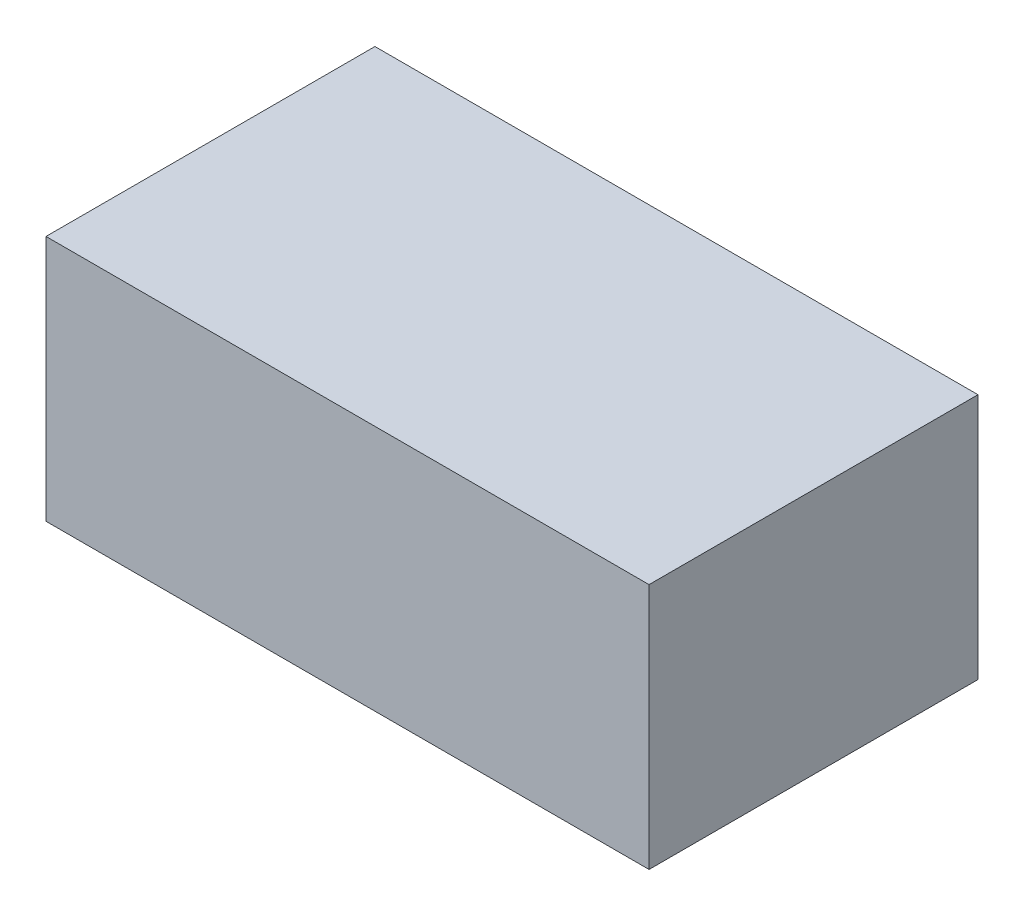
ISO-10303-21;
HEADER;
FILE_DESCRIPTION(('STEP AP214'),'2;1');
FILE_NAME('part.step','',(''),(''),'','','');
FILE_SCHEMA(('AUTOMOTIVE_DESIGN { 1 0 10303 214 1 1 1 1 }'));
ENDSEC;
DATA;
#1=APPLICATION_CONTEXT('core data for automotive mechanical design processes');
#2=APPLICATION_PROTOCOL_DEFINITION('international standard','automotive_design',2000,#1);
#3=PRODUCT_CONTEXT('',#1,'mechanical');
#4=PRODUCT('Part','Part','',(#3));
#5=PRODUCT_RELATED_PRODUCT_CATEGORY('part','',(#4));
#6=PRODUCT_DEFINITION_FORMATION('','',#4);
#7=PRODUCT_DEFINITION_CONTEXT('part definition',#1,'design');
#8=PRODUCT_DEFINITION('design','',#6,#7);
#9=PRODUCT_DEFINITION_SHAPE('','',#8);
#10=(LENGTH_UNIT() NAMED_UNIT(*) SI_UNIT(.MILLI.,.METRE.));
#11=(NAMED_UNIT(*) PLANE_ANGLE_UNIT() SI_UNIT($,.RADIAN.));
#12=(NAMED_UNIT(*) SI_UNIT($,.STERADIAN.) SOLID_ANGLE_UNIT());
#13=UNCERTAINTY_MEASURE_WITH_UNIT(LENGTH_MEASURE(1.E-05),#10,'distance_accuracy_value','');
#14=(GEOMETRIC_REPRESENTATION_CONTEXT(3) GLOBAL_UNCERTAINTY_ASSIGNED_CONTEXT((#13)) GLOBAL_UNIT_ASSIGNED_CONTEXT((#10,
#11,#12)) REPRESENTATION_CONTEXT('',''));
#15=CARTESIAN_POINT('',(0.,0.,0.));
#16=DIRECTION('',(0.,0.,1.));
#17=DIRECTION('',(1.,0.,0.));
#18=AXIS2_PLACEMENT_3D('',#15,#16,#17);
#19=CARTESIAN_POINT('',(-55.,45.,30.));
#20=DIRECTION('',(1.,0.,0.));
#21=DIRECTION('',(0.,0.,-1.));
#22=AXIS2_PLACEMENT_3D('',#19,#20,#21);
#23=PLANE('',#22);
#24=DIRECTION('',(0.,0.,1.));
#25=VECTOR('',#24,1.);
#26=CARTESIAN_POINT('',(-55.,0.,30.));
#27=LINE('',#26,#25);
#28=CARTESIAN_POINT('',(-55.,0.,-30.));
#29=VERTEX_POINT('',#28);
#30=CARTESIAN_POINT('',(-55.,0.,30.));
#31=VERTEX_POINT('',#30);
#32=EDGE_CURVE('E100',#29,#31,#27,.T.);
#33=ORIENTED_EDGE('',*,*,#32,.T.);
#34=DIRECTION('',(0.,-1.,0.));
#35=VECTOR('',#34,1.);
#36=CARTESIAN_POINT('',(-55.,45.,30.));
#37=LINE('',#36,#35);
#38=CARTESIAN_POINT('',(-55.,45.,30.));
#39=VERTEX_POINT('',#38);
#40=EDGE_CURVE('E11',#39,#31,#37,.T.);
#41=ORIENTED_EDGE('',*,*,#40,.F.);
#42=DIRECTION('',(0.,0.,1.));
#43=VECTOR('',#42,1.);
#44=CARTESIAN_POINT('',(-55.,45.,30.));
#45=LINE('',#44,#43);
#46=CARTESIAN_POINT('',(-55.,45.,-30.));
#47=VERTEX_POINT('',#46);
#48=EDGE_CURVE('E88',#47,#39,#45,.T.);
#49=ORIENTED_EDGE('',*,*,#48,.F.);
#50=DIRECTION('',(0.,-1.,0.));
#51=VECTOR('',#50,1.);
#52=CARTESIAN_POINT('',(-55.,45.,-30.));
#53=LINE('',#52,#51);
#54=EDGE_CURVE('E96',#47,#29,#53,.T.);
#55=ORIENTED_EDGE('',*,*,#54,.T.);
#56=EDGE_LOOP('',(#33,#41,#49,#55));
#57=FACE_BOUND('',#56,.T.);
#58=ADVANCED_FACE('F37',(#57),#23,.F.);
#59=CARTESIAN_POINT('',(55.,45.,30.));
#60=DIRECTION('',(0.,0.,-1.));
#61=DIRECTION('',(-1.,0.,0.));
#62=AXIS2_PLACEMENT_3D('',#59,#60,#61);
#63=PLANE('',#62);
#64=DIRECTION('',(1.,0.,0.));
#65=VECTOR('',#64,1.);
#66=CARTESIAN_POINT('',(55.,0.,30.));
#67=LINE('',#66,#65);
#68=CARTESIAN_POINT('',(55.,0.,30.));
#69=VERTEX_POINT('',#68);
#70=EDGE_CURVE('E92',#31,#69,#67,.T.);
#71=ORIENTED_EDGE('',*,*,#70,.T.);
#72=DIRECTION('',(0.,-1.,0.));
#73=VECTOR('',#72,1.);
#74=CARTESIAN_POINT('',(55.,45.,30.));
#75=LINE('',#74,#73);
#76=CARTESIAN_POINT('',(55.,45.,30.));
#77=VERTEX_POINT('',#76);
#78=EDGE_CURVE('E45',#77,#69,#75,.T.);
#79=ORIENTED_EDGE('',*,*,#78,.F.);
#80=DIRECTION('',(1.,0.,0.));
#81=VECTOR('',#80,1.);
#82=CARTESIAN_POINT('',(55.,45.,30.));
#83=LINE('',#82,#81);
#84=EDGE_CURVE('E83',#39,#77,#83,.T.);
#85=ORIENTED_EDGE('',*,*,#84,.F.);
#86=ORIENTED_EDGE('',*,*,#40,.T.);
#87=EDGE_LOOP('',(#71,#79,#85,#86));
#88=FACE_BOUND('',#87,.T.);
#89=ADVANCED_FACE('F91',(#88),#63,.F.);
#90=CARTESIAN_POINT('',(55.,45.,30.));
#91=DIRECTION('',(-1.,0.,0.));
#92=DIRECTION('',(0.,0.,1.));
#93=AXIS2_PLACEMENT_3D('',#90,#91,#92);
#94=PLANE('',#93);
#95=DIRECTION('',(0.,0.,-1.));
#96=VECTOR('',#95,1.);
#97=CARTESIAN_POINT('',(55.,0.,30.));
#98=LINE('',#97,#96);
#99=CARTESIAN_POINT('',(55.,0.,-30.));
#100=VERTEX_POINT('',#99);
#101=EDGE_CURVE('E70',#69,#100,#98,.T.);
#102=ORIENTED_EDGE('',*,*,#101,.T.);
#103=DIRECTION('',(0.,-1.,0.));
#104=VECTOR('',#103,1.);
#105=CARTESIAN_POINT('',(55.,45.,-30.));
#106=LINE('',#105,#104);
#107=CARTESIAN_POINT('',(55.,45.,-30.));
#108=VERTEX_POINT('',#107);
#109=EDGE_CURVE('E93',#108,#100,#106,.T.);
#110=ORIENTED_EDGE('',*,*,#109,.F.);
#111=DIRECTION('',(0.,0.,-1.));
#112=VECTOR('',#111,1.);
#113=CARTESIAN_POINT('',(55.,45.,30.));
#114=LINE('',#113,#112);
#115=EDGE_CURVE('E86',#77,#108,#114,.T.);
#116=ORIENTED_EDGE('',*,*,#115,.F.);
#117=ORIENTED_EDGE('',*,*,#78,.T.);
#118=EDGE_LOOP('',(#102,#110,#116,#117));
#119=FACE_BOUND('',#118,.T.);
#120=ADVANCED_FACE('F94',(#119),#94,.F.);
#121=CARTESIAN_POINT('',(55.,45.,-30.));
#122=DIRECTION('',(0.,0.,1.));
#123=DIRECTION('',(1.,0.,0.));
#124=AXIS2_PLACEMENT_3D('',#121,#122,#123);
#125=PLANE('',#124);
#126=DIRECTION('',(-1.,0.,0.));
#127=VECTOR('',#126,1.);
#128=CARTESIAN_POINT('',(55.,0.,-30.));
#129=LINE('',#128,#127);
#130=EDGE_CURVE('E76',#100,#29,#129,.T.);
#131=ORIENTED_EDGE('',*,*,#130,.T.);
#132=ORIENTED_EDGE('',*,*,#54,.F.);
#133=DIRECTION('',(-1.,0.,0.));
#134=VECTOR('',#133,1.);
#135=CARTESIAN_POINT('',(55.,45.,-30.));
#136=LINE('',#135,#134);
#137=EDGE_CURVE('E53',#108,#47,#136,.T.);
#138=ORIENTED_EDGE('',*,*,#137,.F.);
#139=ORIENTED_EDGE('',*,*,#109,.T.);
#140=EDGE_LOOP('',(#131,#132,#138,#139));
#141=FACE_BOUND('',#140,.T.);
#142=ADVANCED_FACE('F107',(#141),#125,.F.);
#143=CARTESIAN_POINT('',(0.,45.,0.));
#144=DIRECTION('',(0.,1.,0.));
#145=DIRECTION('',(0.,0.,1.));
#146=AXIS2_PLACEMENT_3D('',#143,#144,#145);
#147=PLANE('',#146);
#148=ORIENTED_EDGE('',*,*,#48,.T.);
#149=ORIENTED_EDGE('',*,*,#84,.T.);
#150=ORIENTED_EDGE('',*,*,#115,.T.);
#151=ORIENTED_EDGE('',*,*,#137,.T.);
#152=EDGE_LOOP('',(#148,#149,#150,#151));
#153=FACE_BOUND('',#152,.T.);
#154=ADVANCED_FACE('F84',(#153),#147,.T.);
#155=CARTESIAN_POINT('',(0.,0.,0.));
#156=DIRECTION('',(0.,1.,0.));
#157=DIRECTION('',(0.,0.,1.));
#158=AXIS2_PLACEMENT_3D('',#155,#156,#157);
#159=PLANE('',#158);
#160=ORIENTED_EDGE('',*,*,#32,.F.);
#161=ORIENTED_EDGE('',*,*,#130,.F.);
#162=ORIENTED_EDGE('',*,*,#101,.F.);
#163=ORIENTED_EDGE('',*,*,#70,.F.);
#164=EDGE_LOOP('',(#160,#161,#162,#163));
#165=FACE_BOUND('',#164,.T.);
#166=ADVANCED_FACE('F110',(#165),#159,.F.);
#167=CLOSED_SHELL('',(#58,#89,#120,#142,#154,#166));
#168=MANIFOLD_SOLID_BREP('B2',#167);
#169=ADVANCED_BREP_SHAPE_REPRESENTATION('',(#18,#168),#14);
#170=SHAPE_DEFINITION_REPRESENTATION(#9,#169);
ENDSEC;
END-ISO-10303-21;
